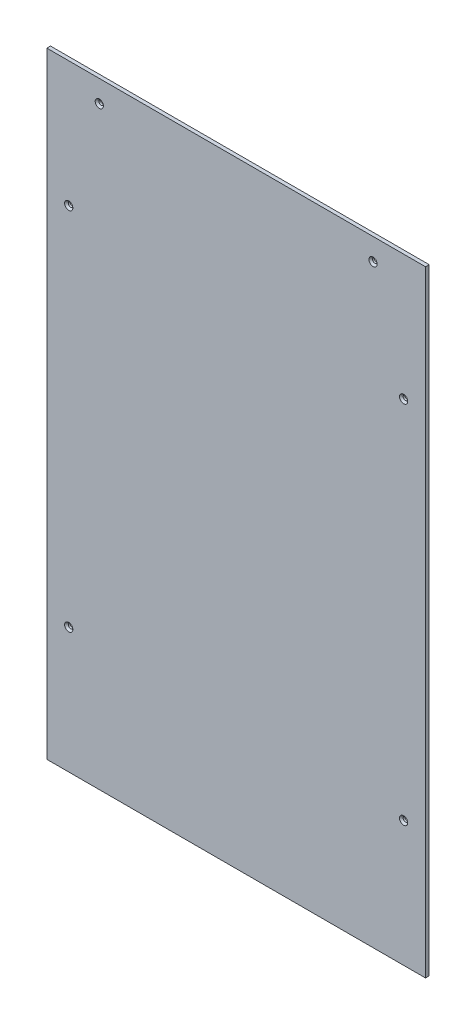
ISO-10303-21;
HEADER;
FILE_DESCRIPTION(('STEP AP214'),'2;1');
FILE_NAME('part.step','',(''),(''),'','','');
FILE_SCHEMA(('AUTOMOTIVE_DESIGN { 1 0 10303 214 1 1 1 1 }'));
ENDSEC;
DATA;
#1=APPLICATION_CONTEXT('core data for automotive mechanical design processes');
#2=APPLICATION_PROTOCOL_DEFINITION('international standard','automotive_design',2000,#1);
#3=PRODUCT_CONTEXT('',#1,'mechanical');
#4=PRODUCT('Part','Part','',(#3));
#5=PRODUCT_RELATED_PRODUCT_CATEGORY('part','',(#4));
#6=PRODUCT_DEFINITION_FORMATION('','',#4);
#7=PRODUCT_DEFINITION_CONTEXT('part definition',#1,'design');
#8=PRODUCT_DEFINITION('design','',#6,#7);
#9=PRODUCT_DEFINITION_SHAPE('','',#8);
#10=(LENGTH_UNIT() NAMED_UNIT(*) SI_UNIT(.MILLI.,.METRE.));
#11=(NAMED_UNIT(*) PLANE_ANGLE_UNIT() SI_UNIT($,.RADIAN.));
#12=(NAMED_UNIT(*) SI_UNIT($,.STERADIAN.) SOLID_ANGLE_UNIT());
#13=UNCERTAINTY_MEASURE_WITH_UNIT(LENGTH_MEASURE(1.E-05),#10,'distance_accuracy_value','');
#14=(GEOMETRIC_REPRESENTATION_CONTEXT(3) GLOBAL_UNCERTAINTY_ASSIGNED_CONTEXT((#13)) GLOBAL_UNIT_ASSIGNED_CONTEXT((#10,
#11,#12)) REPRESENTATION_CONTEXT('',''));
#15=CARTESIAN_POINT('',(0.,0.,0.));
#16=DIRECTION('',(0.,0.,1.));
#17=DIRECTION('',(1.,0.,0.));
#18=AXIS2_PLACEMENT_3D('',#15,#16,#17);
#19=CARTESIAN_POINT('',(207.5,-337.5,2.));
#20=DIRECTION('',(-1.,0.,0.));
#21=DIRECTION('',(0.,0.,1.));
#22=AXIS2_PLACEMENT_3D('',#19,#20,#21);
#23=PLANE('',#22);
#24=DIRECTION('',(0.,1.,0.));
#25=VECTOR('',#24,1.);
#26=CARTESIAN_POINT('',(207.5,-337.5,-2.));
#27=LINE('',#26,#25);
#28=CARTESIAN_POINT('',(207.5,-337.5,-2.));
#29=VERTEX_POINT('',#28);
#30=CARTESIAN_POINT('',(207.5,337.5,-2.));
#31=VERTEX_POINT('',#30);
#32=EDGE_CURVE('E118',#29,#31,#27,.T.);
#33=ORIENTED_EDGE('',*,*,#32,.T.);
#34=DIRECTION('',(0.,0.,-1.));
#35=VECTOR('',#34,1.);
#36=CARTESIAN_POINT('',(207.5,337.5,2.));
#37=LINE('',#36,#35);
#38=CARTESIAN_POINT('',(207.5,337.5,2.));
#39=VERTEX_POINT('',#38);
#40=EDGE_CURVE('E109',#39,#31,#37,.T.);
#41=ORIENTED_EDGE('',*,*,#40,.F.);
#42=DIRECTION('',(0.,1.,0.));
#43=VECTOR('',#42,1.);
#44=CARTESIAN_POINT('',(207.5,-337.5,2.));
#45=LINE('',#44,#43);
#46=CARTESIAN_POINT('',(207.5,-337.5,2.));
#47=VERTEX_POINT('',#46);
#48=EDGE_CURVE('E103',#47,#39,#45,.T.);
#49=ORIENTED_EDGE('',*,*,#48,.F.);
#50=DIRECTION('',(0.,0.,-1.));
#51=VECTOR('',#50,1.);
#52=CARTESIAN_POINT('',(207.5,-337.5,2.));
#53=LINE('',#52,#51);
#54=EDGE_CURVE('E114',#47,#29,#53,.T.);
#55=ORIENTED_EDGE('',*,*,#54,.T.);
#56=EDGE_LOOP('',(#33,#41,#49,#55));
#57=FACE_BOUND('',#56,.T.);
#58=ADVANCED_FACE('F49',(#57),#23,.F.);
#59=CARTESIAN_POINT('',(-207.5,337.5,2.));
#60=DIRECTION('',(0.,-1.,0.));
#61=DIRECTION('',(0.,0.,-1.));
#62=AXIS2_PLACEMENT_3D('',#59,#60,#61);
#63=PLANE('',#62);
#64=DIRECTION('',(-1.,0.,0.));
#65=VECTOR('',#64,1.);
#66=CARTESIAN_POINT('',(-207.5,337.5,-2.));
#67=LINE('',#66,#65);
#68=CARTESIAN_POINT('',(-207.5,337.5,-2.));
#69=VERTEX_POINT('',#68);
#70=EDGE_CURVE('E108',#31,#69,#67,.T.);
#71=ORIENTED_EDGE('',*,*,#70,.T.);
#72=DIRECTION('',(0.,0.,-1.));
#73=VECTOR('',#72,1.);
#74=CARTESIAN_POINT('',(-207.5,337.5,2.));
#75=LINE('',#74,#73);
#76=CARTESIAN_POINT('',(-207.5,337.5,2.));
#77=VERTEX_POINT('',#76);
#78=EDGE_CURVE('E106',#77,#69,#75,.T.);
#79=ORIENTED_EDGE('',*,*,#78,.F.);
#80=DIRECTION('',(-1.,0.,0.));
#81=VECTOR('',#80,1.);
#82=CARTESIAN_POINT('',(-207.5,337.5,2.));
#83=LINE('',#82,#81);
#84=EDGE_CURVE('E98',#39,#77,#83,.T.);
#85=ORIENTED_EDGE('',*,*,#84,.F.);
#86=ORIENTED_EDGE('',*,*,#40,.T.);
#87=EDGE_LOOP('',(#71,#79,#85,#86));
#88=FACE_BOUND('',#87,.T.);
#89=ADVANCED_FACE('F107',(#88),#63,.F.);
#90=CARTESIAN_POINT('',(-207.5,-337.5,2.));
#91=DIRECTION('',(1.,0.,0.));
#92=DIRECTION('',(0.,0.,-1.));
#93=AXIS2_PLACEMENT_3D('',#90,#91,#92);
#94=PLANE('',#93);
#95=DIRECTION('',(0.,-1.,0.));
#96=VECTOR('',#95,1.);
#97=CARTESIAN_POINT('',(-207.5,-337.5,-2.));
#98=LINE('',#97,#96);
#99=CARTESIAN_POINT('',(-207.5,-337.5,-2.));
#100=VERTEX_POINT('',#99);
#101=EDGE_CURVE('E84',#69,#100,#98,.T.);
#102=ORIENTED_EDGE('',*,*,#101,.T.);
#103=DIRECTION('',(0.,0.,-1.));
#104=VECTOR('',#103,1.);
#105=CARTESIAN_POINT('',(-207.5,-337.5,2.));
#106=LINE('',#105,#104);
#107=CARTESIAN_POINT('',(-207.5,-337.5,2.));
#108=VERTEX_POINT('',#107);
#109=EDGE_CURVE('E110',#108,#100,#106,.T.);
#110=ORIENTED_EDGE('',*,*,#109,.F.);
#111=DIRECTION('',(0.,-1.,0.));
#112=VECTOR('',#111,1.);
#113=CARTESIAN_POINT('',(-207.5,-337.5,2.));
#114=LINE('',#113,#112);
#115=EDGE_CURVE('E101',#77,#108,#114,.T.);
#116=ORIENTED_EDGE('',*,*,#115,.F.);
#117=ORIENTED_EDGE('',*,*,#78,.T.);
#118=EDGE_LOOP('',(#102,#110,#116,#117));
#119=FACE_BOUND('',#118,.T.);
#120=ADVANCED_FACE('F112',(#119),#94,.F.);
#121=CARTESIAN_POINT('',(-207.5,-337.5,2.));
#122=DIRECTION('',(0.,1.,0.));
#123=DIRECTION('',(0.,0.,1.));
#124=AXIS2_PLACEMENT_3D('',#121,#122,#123);
#125=PLANE('',#124);
#126=DIRECTION('',(1.,0.,0.));
#127=VECTOR('',#126,1.);
#128=CARTESIAN_POINT('',(-207.5,-337.5,-2.));
#129=LINE('',#128,#127);
#130=EDGE_CURVE('E90',#100,#29,#129,.T.);
#131=ORIENTED_EDGE('',*,*,#130,.T.);
#132=ORIENTED_EDGE('',*,*,#54,.F.);
#133=DIRECTION('',(1.,0.,0.));
#134=VECTOR('',#133,1.);
#135=CARTESIAN_POINT('',(-207.5,-337.5,2.));
#136=LINE('',#135,#134);
#137=EDGE_CURVE('E67',#108,#47,#136,.T.);
#138=ORIENTED_EDGE('',*,*,#137,.F.);
#139=ORIENTED_EDGE('',*,*,#109,.T.);
#140=EDGE_LOOP('',(#131,#132,#138,#139));
#141=FACE_BOUND('',#140,.T.);
#142=ADVANCED_FACE('F271',(#141),#125,.F.);
#143=CARTESIAN_POINT('',(0.,0.,2.));
#144=DIRECTION('',(0.,0.,-1.));
#145=DIRECTION('',(-1.,0.,0.));
#146=AXIS2_PLACEMENT_3D('',#143,#144,#145);
#147=PLANE('',#146);
#148=CARTESIAN_POINT('',(-183.5,200.,2.));
#149=DIRECTION('',(0.,0.,-1.));
#150=DIRECTION('',(-1.,0.,0.));
#151=AXIS2_PLACEMENT_3D('',#148,#149,#150);
#152=CIRCLE('',#151,4.49999999999995);
#153=CARTESIAN_POINT('',(-188.,200.,2.));
#154=VERTEX_POINT('',#153);
#155=EDGE_CURVE('E146',#154,#154,#152,.T.);
#156=ORIENTED_EDGE('',*,*,#155,.T.);
#157=EDGE_LOOP('',(#156));
#158=FACE_BOUND('',#157,.T.);
#159=CARTESIAN_POINT('',(-183.5,-200.,2.));
#160=DIRECTION('',(0.,0.,-1.));
#161=DIRECTION('',(-1.,0.,0.));
#162=AXIS2_PLACEMENT_3D('',#159,#160,#161);
#163=CIRCLE('',#162,4.49999999999995);
#164=CARTESIAN_POINT('',(-188.,-200.,2.));
#165=VERTEX_POINT('',#164);
#166=EDGE_CURVE('E143',#165,#165,#163,.T.);
#167=ORIENTED_EDGE('',*,*,#166,.T.);
#168=EDGE_LOOP('',(#167));
#169=FACE_BOUND('',#168,.T.);
#170=CARTESIAN_POINT('',(183.5,-200.,2.));
#171=DIRECTION('',(0.,0.,-1.));
#172=DIRECTION('',(-1.,0.,0.));
#173=AXIS2_PLACEMENT_3D('',#170,#171,#172);
#174=CIRCLE('',#173,4.49999999999984);
#175=CARTESIAN_POINT('',(179.,-200.,2.));
#176=VERTEX_POINT('',#175);
#177=EDGE_CURVE('E140',#176,#176,#174,.T.);
#178=ORIENTED_EDGE('',*,*,#177,.T.);
#179=EDGE_LOOP('',(#178));
#180=FACE_BOUND('',#179,.T.);
#181=CARTESIAN_POINT('',(183.5,200.,2.));
#182=DIRECTION('',(0.,0.,-1.));
#183=DIRECTION('',(-1.,0.,0.));
#184=AXIS2_PLACEMENT_3D('',#181,#182,#183);
#185=CIRCLE('',#184,4.49999999999984);
#186=CARTESIAN_POINT('',(179.,200.,2.));
#187=VERTEX_POINT('',#186);
#188=EDGE_CURVE('E137',#187,#187,#185,.T.);
#189=ORIENTED_EDGE('',*,*,#188,.T.);
#190=EDGE_LOOP('',(#189));
#191=FACE_BOUND('',#190,.T.);
#192=CARTESIAN_POINT('',(150.,313.5,2.));
#193=DIRECTION('',(0.,0.,-1.));
#194=DIRECTION('',(-1.,0.,0.));
#195=AXIS2_PLACEMENT_3D('',#192,#193,#194);
#196=CIRCLE('',#195,4.49999999999995);
#197=CARTESIAN_POINT('',(145.5,313.5,2.));
#198=VERTEX_POINT('',#197);
#199=EDGE_CURVE('E134',#198,#198,#196,.T.);
#200=ORIENTED_EDGE('',*,*,#199,.T.);
#201=EDGE_LOOP('',(#200));
#202=FACE_BOUND('',#201,.T.);
#203=CARTESIAN_POINT('',(-150.,313.5,2.));
#204=DIRECTION('',(0.,0.,-1.));
#205=DIRECTION('',(-1.,0.,0.));
#206=AXIS2_PLACEMENT_3D('',#203,#204,#205);
#207=CIRCLE('',#206,4.49999999999984);
#208=CARTESIAN_POINT('',(-154.5,313.5,2.));
#209=VERTEX_POINT('',#208);
#210=EDGE_CURVE('E131',#209,#209,#207,.T.);
#211=ORIENTED_EDGE('',*,*,#210,.T.);
#212=EDGE_LOOP('',(#211));
#213=FACE_BOUND('',#212,.T.);
#214=ORIENTED_EDGE('',*,*,#48,.T.);
#215=ORIENTED_EDGE('',*,*,#84,.T.);
#216=ORIENTED_EDGE('',*,*,#115,.T.);
#217=ORIENTED_EDGE('',*,*,#137,.T.);
#218=EDGE_LOOP('',(#214,#215,#216,#217));
#219=FACE_BOUND('',#218,.T.);
#220=ADVANCED_FACE('F99',(#158,#169,#180,#191,#202,#213,#219),#147,.F.);
#221=CARTESIAN_POINT('',(0.,0.,-2.));
#222=DIRECTION('',(0.,0.,-1.));
#223=DIRECTION('',(-1.,0.,0.));
#224=AXIS2_PLACEMENT_3D('',#221,#222,#223);
#225=PLANE('',#224);
#226=CARTESIAN_POINT('',(183.5,-200.,-2.));
#227=DIRECTION('',(0.,0.,1.));
#228=DIRECTION('',(1.,0.,0.));
#229=AXIS2_PLACEMENT_3D('',#226,#227,#228);
#230=CIRCLE('',#229,2.5);
#231=CARTESIAN_POINT('',(186.,-200.,-2.));
#232=VERTEX_POINT('',#231);
#233=EDGE_CURVE('E224',#232,#232,#230,.T.);
#234=ORIENTED_EDGE('',*,*,#233,.T.);
#235=EDGE_LOOP('',(#234));
#236=FACE_BOUND('',#235,.T.);
#237=CARTESIAN_POINT('',(150.,313.5,-2.));
#238=DIRECTION('',(0.,0.,1.));
#239=DIRECTION('',(1.,0.,0.));
#240=AXIS2_PLACEMENT_3D('',#237,#238,#239);
#241=CIRCLE('',#240,2.5);
#242=CARTESIAN_POINT('',(152.5,313.5,-2.));
#243=VERTEX_POINT('',#242);
#244=EDGE_CURVE('E226',#243,#243,#241,.T.);
#245=ORIENTED_EDGE('',*,*,#244,.T.);
#246=EDGE_LOOP('',(#245));
#247=FACE_BOUND('',#246,.T.);
#248=CARTESIAN_POINT('',(-150.,313.5,-2.));
#249=DIRECTION('',(0.,0.,1.));
#250=DIRECTION('',(1.,0.,0.));
#251=AXIS2_PLACEMENT_3D('',#248,#249,#250);
#252=CIRCLE('',#251,2.5);
#253=CARTESIAN_POINT('',(-147.5,313.5,-2.));
#254=VERTEX_POINT('',#253);
#255=EDGE_CURVE('E231',#254,#254,#252,.T.);
#256=ORIENTED_EDGE('',*,*,#255,.T.);
#257=EDGE_LOOP('',(#256));
#258=FACE_BOUND('',#257,.T.);
#259=CARTESIAN_POINT('',(-183.5,200.,-2.));
#260=DIRECTION('',(0.,0.,1.));
#261=DIRECTION('',(1.,0.,0.));
#262=AXIS2_PLACEMENT_3D('',#259,#260,#261);
#263=CIRCLE('',#262,2.5);
#264=CARTESIAN_POINT('',(-181.,200.,-2.));
#265=VERTEX_POINT('',#264);
#266=EDGE_CURVE('E238',#265,#265,#263,.T.);
#267=ORIENTED_EDGE('',*,*,#266,.T.);
#268=EDGE_LOOP('',(#267));
#269=FACE_BOUND('',#268,.T.);
#270=CARTESIAN_POINT('',(-183.5,-200.,-2.));
#271=DIRECTION('',(0.,0.,1.));
#272=DIRECTION('',(1.,0.,0.));
#273=AXIS2_PLACEMENT_3D('',#270,#271,#272);
#274=CIRCLE('',#273,2.5);
#275=CARTESIAN_POINT('',(-181.,-200.,-2.));
#276=VERTEX_POINT('',#275);
#277=EDGE_CURVE('E234',#276,#276,#274,.T.);
#278=ORIENTED_EDGE('',*,*,#277,.T.);
#279=EDGE_LOOP('',(#278));
#280=FACE_BOUND('',#279,.T.);
#281=CARTESIAN_POINT('',(183.5,200.,-2.));
#282=DIRECTION('',(0.,0.,1.));
#283=DIRECTION('',(1.,0.,0.));
#284=AXIS2_PLACEMENT_3D('',#281,#282,#283);
#285=CIRCLE('',#284,2.5);
#286=CARTESIAN_POINT('',(186.,200.,-2.));
#287=VERTEX_POINT('',#286);
#288=EDGE_CURVE('E121',#287,#287,#285,.T.);
#289=ORIENTED_EDGE('',*,*,#288,.T.);
#290=EDGE_LOOP('',(#289));
#291=FACE_BOUND('',#290,.T.);
#292=ORIENTED_EDGE('',*,*,#32,.F.);
#293=ORIENTED_EDGE('',*,*,#130,.F.);
#294=ORIENTED_EDGE('',*,*,#101,.F.);
#295=ORIENTED_EDGE('',*,*,#70,.F.);
#296=EDGE_LOOP('',(#292,#293,#294,#295));
#297=FACE_BOUND('',#296,.T.);
#298=ADVANCED_FACE('F245',(#236,#247,#258,#269,#280,#291,#297),#225,.T.);
#299=CARTESIAN_POINT('',(183.5,200.,-2.));
#300=DIRECTION('',(0.,0.,1.));
#301=DIRECTION('',(1.,0.,0.));
#302=AXIS2_PLACEMENT_3D('',#299,#300,#301);
#303=CYLINDRICAL_SURFACE('',#302,2.5);
#304=CARTESIAN_POINT('',(183.5,200.,1.49619899803E-13));
#305=DIRECTION('',(0.,0.,-1.));
#306=DIRECTION('',(-1.,0.,0.));
#307=AXIS2_PLACEMENT_3D('',#304,#305,#306);
#308=CIRCLE('',#307,2.5);
#309=CARTESIAN_POINT('',(181.,200.,1.49619899803E-13));
#310=VERTEX_POINT('',#309);
#311=EDGE_CURVE('E155',#310,#310,#308,.F.);
#312=ORIENTED_EDGE('',*,*,#311,.T.);
#313=EDGE_LOOP('',(#312));
#314=FACE_BOUND('',#313,.T.);
#315=ORIENTED_EDGE('',*,*,#288,.F.);
#316=EDGE_LOOP('',(#315));
#317=FACE_BOUND('',#316,.T.);
#318=ADVANCED_FACE('F251',(#314,#317),#303,.F.);
#319=CARTESIAN_POINT('',(-183.5,-200.,-2.));
#320=DIRECTION('',(0.,0.,1.));
#321=DIRECTION('',(1.,0.,0.));
#322=AXIS2_PLACEMENT_3D('',#319,#320,#321);
#323=CYLINDRICAL_SURFACE('',#322,2.5);
#324=CARTESIAN_POINT('',(-183.5,-200.,0.));
#325=DIRECTION('',(0.,0.,-1.));
#326=DIRECTION('',(-1.,0.,0.));
#327=AXIS2_PLACEMENT_3D('',#324,#325,#326);
#328=CIRCLE('',#327,2.5);
#329=CARTESIAN_POINT('',(-186.,-200.,0.));
#330=VERTEX_POINT('',#329);
#331=EDGE_CURVE('E149',#330,#330,#328,.F.);
#332=ORIENTED_EDGE('',*,*,#331,.T.);
#333=EDGE_LOOP('',(#332));
#334=FACE_BOUND('',#333,.T.);
#335=ORIENTED_EDGE('',*,*,#277,.F.);
#336=EDGE_LOOP('',(#335));
#337=FACE_BOUND('',#336,.T.);
#338=ADVANCED_FACE('F248',(#334,#337),#323,.F.);
#339=CARTESIAN_POINT('',(-183.5,200.,-2.));
#340=DIRECTION('',(0.,0.,1.));
#341=DIRECTION('',(1.,0.,0.));
#342=AXIS2_PLACEMENT_3D('',#339,#340,#341);
#343=CYLINDRICAL_SURFACE('',#342,2.5);
#344=CARTESIAN_POINT('',(-183.5,200.,0.));
#345=DIRECTION('',(0.,0.,-1.));
#346=DIRECTION('',(-1.,0.,0.));
#347=AXIS2_PLACEMENT_3D('',#344,#345,#346);
#348=CIRCLE('',#347,2.5);
#349=CARTESIAN_POINT('',(-186.,200.,0.));
#350=VERTEX_POINT('',#349);
#351=EDGE_CURVE('E128',#350,#350,#348,.F.);
#352=ORIENTED_EDGE('',*,*,#351,.T.);
#353=EDGE_LOOP('',(#352));
#354=FACE_BOUND('',#353,.T.);
#355=ORIENTED_EDGE('',*,*,#266,.F.);
#356=EDGE_LOOP('',(#355));
#357=FACE_BOUND('',#356,.T.);
#358=ADVANCED_FACE('F250',(#354,#357),#343,.F.);
#359=CARTESIAN_POINT('',(-150.,313.5,-2.));
#360=DIRECTION('',(0.,0.,1.));
#361=DIRECTION('',(1.,0.,0.));
#362=AXIS2_PLACEMENT_3D('',#359,#360,#361);
#363=CYLINDRICAL_SURFACE('',#362,2.5);
#364=CARTESIAN_POINT('',(-150.,313.5,1.49619899803E-13));
#365=DIRECTION('',(0.,0.,-1.));
#366=DIRECTION('',(-1.,0.,0.));
#367=AXIS2_PLACEMENT_3D('',#364,#365,#366);
#368=CIRCLE('',#367,2.5);
#369=CARTESIAN_POINT('',(-152.5,313.5,1.49619899803E-13));
#370=VERTEX_POINT('',#369);
#371=EDGE_CURVE('E11',#370,#370,#368,.F.);
#372=ORIENTED_EDGE('',*,*,#371,.T.);
#373=EDGE_LOOP('',(#372));
#374=FACE_BOUND('',#373,.T.);
#375=ORIENTED_EDGE('',*,*,#255,.F.);
#376=EDGE_LOOP('',(#375));
#377=FACE_BOUND('',#376,.T.);
#378=ADVANCED_FACE('F258',(#374,#377),#363,.F.);
#379=CARTESIAN_POINT('',(150.,313.5,-2.));
#380=DIRECTION('',(0.,0.,1.));
#381=DIRECTION('',(1.,0.,0.));
#382=AXIS2_PLACEMENT_3D('',#379,#380,#381);
#383=CYLINDRICAL_SURFACE('',#382,2.5);
#384=CARTESIAN_POINT('',(150.,313.5,0.));
#385=DIRECTION('',(0.,0.,-1.));
#386=DIRECTION('',(-1.,0.,0.));
#387=AXIS2_PLACEMENT_3D('',#384,#385,#386);
#388=CIRCLE('',#387,2.5);
#389=CARTESIAN_POINT('',(147.5,313.5,0.));
#390=VERTEX_POINT('',#389);
#391=EDGE_CURVE('E59',#390,#390,#388,.F.);
#392=ORIENTED_EDGE('',*,*,#391,.T.);
#393=EDGE_LOOP('',(#392));
#394=FACE_BOUND('',#393,.T.);
#395=ORIENTED_EDGE('',*,*,#244,.F.);
#396=EDGE_LOOP('',(#395));
#397=FACE_BOUND('',#396,.T.);
#398=ADVANCED_FACE('F160',(#394,#397),#383,.F.);
#399=CARTESIAN_POINT('',(183.5,-200.,-2.));
#400=DIRECTION('',(0.,0.,1.));
#401=DIRECTION('',(1.,0.,0.));
#402=AXIS2_PLACEMENT_3D('',#399,#400,#401);
#403=CYLINDRICAL_SURFACE('',#402,2.5);
#404=CARTESIAN_POINT('',(183.5,-200.,1.49619899803E-13));
#405=DIRECTION('',(0.,0.,-1.));
#406=DIRECTION('',(-1.,0.,0.));
#407=AXIS2_PLACEMENT_3D('',#404,#405,#406);
#408=CIRCLE('',#407,2.5);
#409=CARTESIAN_POINT('',(181.,-200.,1.49619899803E-13));
#410=VERTEX_POINT('',#409);
#411=EDGE_CURVE('E152',#410,#410,#408,.F.);
#412=ORIENTED_EDGE('',*,*,#411,.T.);
#413=EDGE_LOOP('',(#412));
#414=FACE_BOUND('',#413,.T.);
#415=ORIENTED_EDGE('',*,*,#233,.F.);
#416=EDGE_LOOP('',(#415));
#417=FACE_BOUND('',#416,.T.);
#418=ADVANCED_FACE('F194',(#414,#417),#403,.F.);
#419=CARTESIAN_POINT('',(-183.5,200.,0.));
#420=DIRECTION('',(0.,0.,1.));
#421=DIRECTION('',(1.,0.,0.));
#422=AXIS2_PLACEMENT_3D('',#419,#420,#421);
#423=CONICAL_SURFACE('',#422,2.5,0.785398163397418);
#424=ORIENTED_EDGE('',*,*,#155,.F.);
#425=EDGE_LOOP('',(#424));
#426=FACE_BOUND('',#425,.T.);
#427=ORIENTED_EDGE('',*,*,#351,.F.);
#428=EDGE_LOOP('',(#427));
#429=FACE_BOUND('',#428,.T.);
#430=ADVANCED_FACE('F187',(#426,#429),#423,.F.);
#431=CARTESIAN_POINT('',(-183.5,-200.,0.));
#432=DIRECTION('',(0.,0.,1.));
#433=DIRECTION('',(1.,0.,0.));
#434=AXIS2_PLACEMENT_3D('',#431,#432,#433);
#435=CONICAL_SURFACE('',#434,2.5,0.785398163397418);
#436=ORIENTED_EDGE('',*,*,#166,.F.);
#437=EDGE_LOOP('',(#436));
#438=FACE_BOUND('',#437,.T.);
#439=ORIENTED_EDGE('',*,*,#331,.F.);
#440=EDGE_LOOP('',(#439));
#441=FACE_BOUND('',#440,.T.);
#442=ADVANCED_FACE('F193',(#438,#441),#435,.F.);
#443=CARTESIAN_POINT('',(183.5,-200.,1.49619899803E-13));
#444=DIRECTION('',(0.,0.,1.));
#445=DIRECTION('',(1.,0.,0.));
#446=AXIS2_PLACEMENT_3D('',#443,#444,#445);
#447=CONICAL_SURFACE('',#446,2.5,0.785398163397446);
#448=ORIENTED_EDGE('',*,*,#177,.F.);
#449=EDGE_LOOP('',(#448));
#450=FACE_BOUND('',#449,.T.);
#451=ORIENTED_EDGE('',*,*,#411,.F.);
#452=EDGE_LOOP('',(#451));
#453=FACE_BOUND('',#452,.T.);
#454=ADVANCED_FACE('F172',(#450,#453),#447,.F.);
#455=CARTESIAN_POINT('',(183.5,200.,1.49619899803E-13));
#456=DIRECTION('',(0.,0.,1.));
#457=DIRECTION('',(1.,0.,0.));
#458=AXIS2_PLACEMENT_3D('',#455,#456,#457);
#459=CONICAL_SURFACE('',#458,2.5,0.785398163397446);
#460=ORIENTED_EDGE('',*,*,#188,.F.);
#461=EDGE_LOOP('',(#460));
#462=FACE_BOUND('',#461,.T.);
#463=ORIENTED_EDGE('',*,*,#311,.F.);
#464=EDGE_LOOP('',(#463));
#465=FACE_BOUND('',#464,.T.);
#466=ADVANCED_FACE('F165',(#462,#465),#459,.F.);
#467=CARTESIAN_POINT('',(150.,313.5,0.));
#468=DIRECTION('',(0.,0.,1.));
#469=DIRECTION('',(1.,0.,0.));
#470=AXIS2_PLACEMENT_3D('',#467,#468,#469);
#471=CONICAL_SURFACE('',#470,2.5,0.785398163397418);
#472=ORIENTED_EDGE('',*,*,#199,.F.);
#473=EDGE_LOOP('',(#472));
#474=FACE_BOUND('',#473,.T.);
#475=ORIENTED_EDGE('',*,*,#391,.F.);
#476=EDGE_LOOP('',(#475));
#477=FACE_BOUND('',#476,.T.);
#478=ADVANCED_FACE('F163',(#474,#477),#471,.F.);
#479=CARTESIAN_POINT('',(-150.,313.5,1.49619899803E-13));
#480=DIRECTION('',(0.,0.,1.));
#481=DIRECTION('',(1.,0.,0.));
#482=AXIS2_PLACEMENT_3D('',#479,#480,#481);
#483=CONICAL_SURFACE('',#482,2.5,0.785398163397446);
#484=ORIENTED_EDGE('',*,*,#210,.F.);
#485=EDGE_LOOP('',(#484));
#486=FACE_BOUND('',#485,.T.);
#487=ORIENTED_EDGE('',*,*,#371,.F.);
#488=EDGE_LOOP('',(#487));
#489=FACE_BOUND('',#488,.T.);
#490=ADVANCED_FACE('F52',(#486,#489),#483,.F.);
#491=CLOSED_SHELL('',(#58,#89,#120,#142,#220,#298,#318,#338,#358,#378,#398,#418,#430,#442,#454,
#466,#478,#490));
#492=MANIFOLD_SOLID_BREP('B2',#491);
#493=ADVANCED_BREP_SHAPE_REPRESENTATION('',(#18,#492),#14);
#494=SHAPE_DEFINITION_REPRESENTATION(#9,#493);
ENDSEC;
END-ISO-10303-21;
